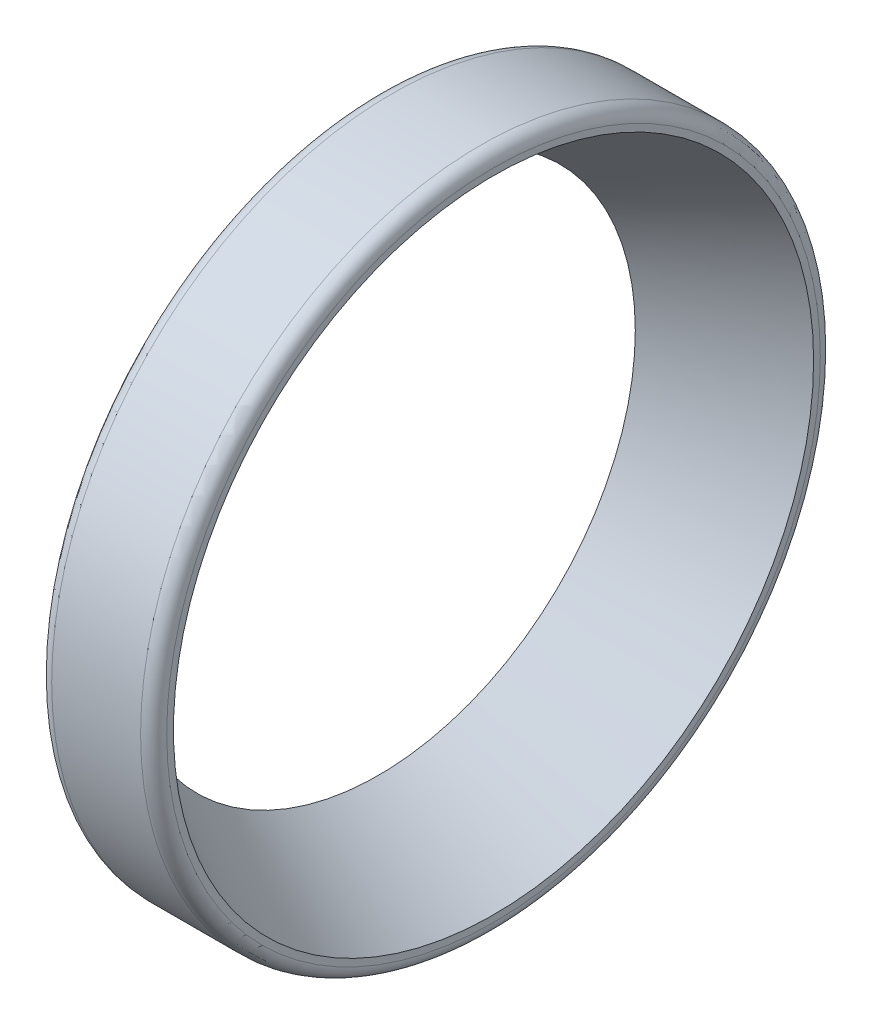
ISO-10303-21;
HEADER;
FILE_DESCRIPTION(('STEP AP214'),'2;1');
FILE_NAME('part.step','',(''),(''),'','','');
FILE_SCHEMA(('AUTOMOTIVE_DESIGN { 1 0 10303 214 1 1 1 1 }'));
ENDSEC;
DATA;
#1=APPLICATION_CONTEXT('core data for automotive mechanical design processes');
#2=APPLICATION_PROTOCOL_DEFINITION('international standard','automotive_design',2000,#1);
#3=PRODUCT_CONTEXT('',#1,'mechanical');
#4=PRODUCT('Part','Part','',(#3));
#5=PRODUCT_RELATED_PRODUCT_CATEGORY('part','',(#4));
#6=PRODUCT_DEFINITION_FORMATION('','',#4);
#7=PRODUCT_DEFINITION_CONTEXT('part definition',#1,'design');
#8=PRODUCT_DEFINITION('design','',#6,#7);
#9=PRODUCT_DEFINITION_SHAPE('','',#8);
#10=(LENGTH_UNIT() NAMED_UNIT(*) SI_UNIT(.MILLI.,.METRE.));
#11=(NAMED_UNIT(*) PLANE_ANGLE_UNIT() SI_UNIT($,.RADIAN.));
#12=(NAMED_UNIT(*) SI_UNIT($,.STERADIAN.) SOLID_ANGLE_UNIT());
#13=UNCERTAINTY_MEASURE_WITH_UNIT(LENGTH_MEASURE(1.E-05),#10,'distance_accuracy_value','');
#14=(GEOMETRIC_REPRESENTATION_CONTEXT(3) GLOBAL_UNCERTAINTY_ASSIGNED_CONTEXT((#13)) GLOBAL_UNIT_ASSIGNED_CONTEXT((#10,
#11,#12)) REPRESENTATION_CONTEXT('',''));
#15=CARTESIAN_POINT('',(0.,0.,0.));
#16=DIRECTION('',(0.,0.,1.));
#17=DIRECTION('',(1.,0.,0.));
#18=AXIS2_PLACEMENT_3D('',#15,#16,#17);
#19=CARTESIAN_POINT('',(-30.9999999999987,0.,0.));
#20=DIRECTION('',(1.,0.,0.));
#21=DIRECTION('',(0.,0.,-1.));
#22=AXIS2_PLACEMENT_3D('',#19,#20,#21);
#23=TOROIDAL_SURFACE('',#22,62.4999999999987,2.50000000000127);
#24=CARTESIAN_POINT('',(-33.5,0.,0.));
#25=DIRECTION('',(1.,0.,0.));
#26=DIRECTION('',(0.,0.,-1.));
#27=AXIS2_PLACEMENT_3D('',#24,#25,#26);
#28=CIRCLE('',#27,62.5000002712039);
#29=CARTESIAN_POINT('',(-33.5,0.,-62.5000002712039));
#30=VERTEX_POINT('',#29);
#31=EDGE_CURVE('E38',#30,#30,#28,.T.);
#32=ORIENTED_EDGE('',*,*,#31,.T.);
#33=EDGE_LOOP('',(#32));
#34=FACE_BOUND('',#33,.T.);
#35=CARTESIAN_POINT('',(-31.,0.,0.));
#36=DIRECTION('',(1.,0.,0.));
#37=DIRECTION('',(0.,0.,-1.));
#38=AXIS2_PLACEMENT_3D('',#35,#36,#37);
#39=CIRCLE('',#38,65.);
#40=CARTESIAN_POINT('',(-31.,0.,-65.));
#41=VERTEX_POINT('',#40);
#42=EDGE_CURVE('E35',#41,#41,#39,.T.);
#43=ORIENTED_EDGE('',*,*,#42,.F.);
#44=EDGE_LOOP('',(#43));
#45=FACE_BOUND('',#44,.T.);
#46=ADVANCED_FACE('F15',(#34,#45),#23,.T.);
#47=CARTESIAN_POINT('',(-33.5,62.5,0.));
#48=DIRECTION('',(-1.,0.,0.));
#49=DIRECTION('',(0.,0.,1.));
#50=AXIS2_PLACEMENT_3D('',#47,#48,#49);
#51=PLANE('',#50);
#52=CARTESIAN_POINT('',(-33.5,0.,0.));
#53=DIRECTION('',(1.,0.,0.));
#54=DIRECTION('',(0.,0.,-1.));
#55=AXIS2_PLACEMENT_3D('',#52,#53,#54);
#56=CIRCLE('',#55,49.118);
#57=CARTESIAN_POINT('',(-33.5,0.,-49.118));
#58=VERTEX_POINT('',#57);
#59=EDGE_CURVE('E30',#58,#58,#56,.T.);
#60=ORIENTED_EDGE('',*,*,#59,.T.);
#61=EDGE_LOOP('',(#60));
#62=FACE_BOUND('',#61,.T.);
#63=ORIENTED_EDGE('',*,*,#31,.F.);
#64=EDGE_LOOP('',(#63));
#65=FACE_BOUND('',#64,.T.);
#66=ADVANCED_FACE('F44',(#62,#65),#51,.T.);
#67=CARTESIAN_POINT('',(-11.5,0.,0.));
#68=DIRECTION('',(1.,0.,0.));
#69=DIRECTION('',(0.,0.,-1.));
#70=AXIS2_PLACEMENT_3D('',#67,#68,#69);
#71=CYLINDRICAL_SURFACE('',#70,65.);
#72=ORIENTED_EDGE('',*,*,#42,.T.);
#73=EDGE_LOOP('',(#72));
#74=FACE_BOUND('',#73,.T.);
#75=CARTESIAN_POINT('',(-14.,0.,0.));
#76=DIRECTION('',(1.,0.,0.));
#77=DIRECTION('',(0.,0.,-1.));
#78=AXIS2_PLACEMENT_3D('',#75,#76,#77);
#79=CIRCLE('',#78,65.);
#80=CARTESIAN_POINT('',(-14.,0.,-65.));
#81=VERTEX_POINT('',#80);
#82=EDGE_CURVE('E26',#81,#81,#79,.T.);
#83=ORIENTED_EDGE('',*,*,#82,.F.);
#84=EDGE_LOOP('',(#83));
#85=FACE_BOUND('',#84,.T.);
#86=ADVANCED_FACE('F46',(#74,#85),#71,.T.);
#87=CARTESIAN_POINT('',(-33.5,0.,0.));
#88=DIRECTION('',(1.,0.,0.));
#89=DIRECTION('',(0.,0.,-1.));
#90=AXIS2_PLACEMENT_3D('',#87,#88,#89);
#91=CONICAL_SURFACE('',#90,49.118,0.502843210927861);
#92=CARTESIAN_POINT('',(-11.5,0.,0.));
#93=DIRECTION('',(1.,0.,0.));
#94=DIRECTION('',(0.,0.,-1.));
#95=AXIS2_PLACEMENT_3D('',#92,#93,#94);
#96=CIRCLE('',#95,61.218);
#97=CARTESIAN_POINT('',(-11.5,0.,-61.218));
#98=VERTEX_POINT('',#97);
#99=EDGE_CURVE('E22',#98,#98,#96,.T.);
#100=ORIENTED_EDGE('',*,*,#99,.T.);
#101=EDGE_LOOP('',(#100));
#102=FACE_BOUND('',#101,.T.);
#103=ORIENTED_EDGE('',*,*,#59,.F.);
#104=EDGE_LOOP('',(#103));
#105=FACE_BOUND('',#104,.T.);
#106=ADVANCED_FACE('F54',(#102,#105),#91,.F.);
#107=CARTESIAN_POINT('',(-14.0000000000013,0.,0.));
#108=DIRECTION('',(1.,0.,0.));
#109=DIRECTION('',(0.,0.,-1.));
#110=AXIS2_PLACEMENT_3D('',#107,#108,#109);
#111=TOROIDAL_SURFACE('',#110,62.4999999999987,2.50000000000126);
#112=ORIENTED_EDGE('',*,*,#82,.T.);
#113=EDGE_LOOP('',(#112));
#114=FACE_BOUND('',#113,.T.);
#115=CARTESIAN_POINT('',(-11.5,0.,0.));
#116=DIRECTION('',(1.,0.,0.));
#117=DIRECTION('',(0.,0.,-1.));
#118=AXIS2_PLACEMENT_3D('',#115,#116,#117);
#119=CIRCLE('',#118,62.5000000526823);
#120=CARTESIAN_POINT('',(-11.5,0.,-62.5000000526823));
#121=VERTEX_POINT('',#120);
#122=EDGE_CURVE('E10',#121,#121,#119,.T.);
#123=ORIENTED_EDGE('',*,*,#122,.F.);
#124=EDGE_LOOP('',(#123));
#125=FACE_BOUND('',#124,.T.);
#126=ADVANCED_FACE('F60',(#114,#125),#111,.T.);
#127=CARTESIAN_POINT('',(-11.5,61.218,0.));
#128=DIRECTION('',(1.,0.,0.));
#129=DIRECTION('',(0.,0.,-1.));
#130=AXIS2_PLACEMENT_3D('',#127,#128,#129);
#131=PLANE('',#130);
#132=ORIENTED_EDGE('',*,*,#122,.T.);
#133=EDGE_LOOP('',(#132));
#134=FACE_BOUND('',#133,.T.);
#135=ORIENTED_EDGE('',*,*,#99,.F.);
#136=EDGE_LOOP('',(#135));
#137=FACE_BOUND('',#136,.T.);
#138=ADVANCED_FACE('F17',(#134,#137),#131,.T.);
#139=CLOSED_SHELL('',(#46,#66,#86,#106,#126,#138));
#140=MANIFOLD_SOLID_BREP('B1',#139);
#141=ADVANCED_BREP_SHAPE_REPRESENTATION('',(#18,#140),#14);
#142=SHAPE_DEFINITION_REPRESENTATION(#9,#141);
ENDSEC;
END-ISO-10303-21;
